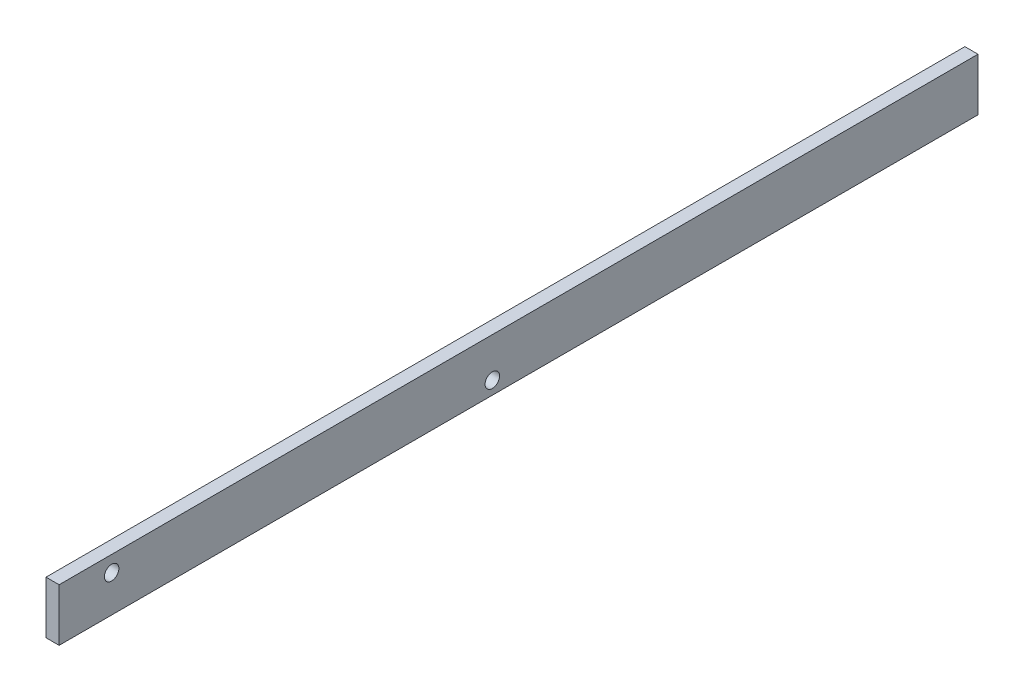
ISO-10303-21;
HEADER;
FILE_DESCRIPTION(('STEP AP214'),'2;1');
FILE_NAME('part.step','',(''),(''),'','','');
FILE_SCHEMA(('AUTOMOTIVE_DESIGN { 1 0 10303 214 1 1 1 1 }'));
ENDSEC;
DATA;
#1=APPLICATION_CONTEXT('core data for automotive mechanical design processes');
#2=APPLICATION_PROTOCOL_DEFINITION('international standard','automotive_design',2000,#1);
#3=PRODUCT_CONTEXT('',#1,'mechanical');
#4=PRODUCT('Part','Part','',(#3));
#5=PRODUCT_RELATED_PRODUCT_CATEGORY('part','',(#4));
#6=PRODUCT_DEFINITION_FORMATION('','',#4);
#7=PRODUCT_DEFINITION_CONTEXT('part definition',#1,'design');
#8=PRODUCT_DEFINITION('design','',#6,#7);
#9=PRODUCT_DEFINITION_SHAPE('','',#8);
#10=(LENGTH_UNIT() NAMED_UNIT(*) SI_UNIT(.MILLI.,.METRE.));
#11=(NAMED_UNIT(*) PLANE_ANGLE_UNIT() SI_UNIT($,.RADIAN.));
#12=(NAMED_UNIT(*) SI_UNIT($,.STERADIAN.) SOLID_ANGLE_UNIT());
#13=UNCERTAINTY_MEASURE_WITH_UNIT(LENGTH_MEASURE(1.E-05),#10,'distance_accuracy_value','');
#14=(GEOMETRIC_REPRESENTATION_CONTEXT(3) GLOBAL_UNCERTAINTY_ASSIGNED_CONTEXT((#13)) GLOBAL_UNIT_ASSIGNED_CONTEXT((#10,
#11,#12)) REPRESENTATION_CONTEXT('',''));
#15=CARTESIAN_POINT('',(0.,0.,0.));
#16=DIRECTION('',(0.,0.,1.));
#17=DIRECTION('',(1.,0.,0.));
#18=AXIS2_PLACEMENT_3D('',#15,#16,#17);
#19=CARTESIAN_POINT('',(0.,0.,222.25));
#20=DIRECTION('',(1.,0.,0.));
#21=DIRECTION('',(0.,1.,0.));
#22=AXIS2_PLACEMENT_3D('',#19,#20,#21);
#23=PLANE('',#22);
#24=CARTESIAN_POINT('',(0.,-9.525,117.475));
#25=DIRECTION('',(1.,0.,0.));
#26=DIRECTION('',(0.,0.,-1.));
#27=AXIS2_PLACEMENT_3D('',#24,#25,#26);
#28=CIRCLE('',#27,1.75259999999999);
#29=CARTESIAN_POINT('',(0.,-9.525,115.7224));
#30=VERTEX_POINT('',#29);
#31=EDGE_CURVE('E139',#30,#30,#28,.T.);
#32=ORIENTED_EDGE('',*,*,#31,.T.);
#33=EDGE_LOOP('',(#32));
#34=FACE_BOUND('',#33,.T.);
#35=CARTESIAN_POINT('',(0.,-3.81,209.55));
#36=DIRECTION('',(1.,0.,0.));
#37=DIRECTION('',(0.,0.,-1.));
#38=AXIS2_PLACEMENT_3D('',#35,#36,#37);
#39=CIRCLE('',#38,1.7526);
#40=CARTESIAN_POINT('',(0.,-3.81,207.7974));
#41=VERTEX_POINT('',#40);
#42=EDGE_CURVE('E115',#41,#41,#39,.T.);
#43=ORIENTED_EDGE('',*,*,#42,.T.);
#44=EDGE_LOOP('',(#43));
#45=FACE_BOUND('',#44,.T.);
#46=DIRECTION('',(0.,-1.,0.));
#47=VECTOR('',#46,1.);
#48=CARTESIAN_POINT('',(0.,0.,0.));
#49=LINE('',#48,#47);
#50=CARTESIAN_POINT('',(0.,0.,0.));
#51=VERTEX_POINT('',#50);
#52=CARTESIAN_POINT('',(0.,-12.7,0.));
#53=VERTEX_POINT('',#52);
#54=EDGE_CURVE('E111',#51,#53,#49,.T.);
#55=ORIENTED_EDGE('',*,*,#54,.T.);
#56=DIRECTION('',(0.,0.,-1.));
#57=VECTOR('',#56,1.);
#58=CARTESIAN_POINT('',(0.,-12.7,222.25));
#59=LINE('',#58,#57);
#60=CARTESIAN_POINT('',(0.,-12.7,222.25));
#61=VERTEX_POINT('',#60);
#62=EDGE_CURVE('E11',#61,#53,#59,.T.);
#63=ORIENTED_EDGE('',*,*,#62,.F.);
#64=DIRECTION('',(0.,-1.,0.));
#65=VECTOR('',#64,1.);
#66=CARTESIAN_POINT('',(0.,0.,222.25));
#67=LINE('',#66,#65);
#68=CARTESIAN_POINT('',(0.,0.,222.25));
#69=VERTEX_POINT('',#68);
#70=EDGE_CURVE('E95',#69,#61,#67,.T.);
#71=ORIENTED_EDGE('',*,*,#70,.F.);
#72=DIRECTION('',(0.,0.,-1.));
#73=VECTOR('',#72,1.);
#74=CARTESIAN_POINT('',(0.,0.,222.25));
#75=LINE('',#74,#73);
#76=EDGE_CURVE('E107',#69,#51,#75,.T.);
#77=ORIENTED_EDGE('',*,*,#76,.T.);
#78=EDGE_LOOP('',(#55,#63,#71,#77));
#79=FACE_BOUND('',#78,.T.);
#80=ADVANCED_FACE('F43',(#34,#45,#79),#23,.F.);
#81=CARTESIAN_POINT('',(0.,-12.7,222.25));
#82=DIRECTION('',(0.,1.,0.));
#83=DIRECTION('',(0.,0.,1.));
#84=AXIS2_PLACEMENT_3D('',#81,#82,#83);
#85=PLANE('',#84);
#86=DIRECTION('',(1.,0.,0.));
#87=VECTOR('',#86,1.);
#88=CARTESIAN_POINT('',(0.,-12.7,0.));
#89=LINE('',#88,#87);
#90=CARTESIAN_POINT('',(3.175,-12.7,0.));
#91=VERTEX_POINT('',#90);
#92=EDGE_CURVE('E100',#53,#91,#89,.T.);
#93=ORIENTED_EDGE('',*,*,#92,.T.);
#94=DIRECTION('',(0.,0.,-1.));
#95=VECTOR('',#94,1.);
#96=CARTESIAN_POINT('',(3.175,-12.7,222.25));
#97=LINE('',#96,#95);
#98=CARTESIAN_POINT('',(3.175,-12.7,222.25));
#99=VERTEX_POINT('',#98);
#100=EDGE_CURVE('E52',#99,#91,#97,.T.);
#101=ORIENTED_EDGE('',*,*,#100,.F.);
#102=DIRECTION('',(1.,0.,0.));
#103=VECTOR('',#102,1.);
#104=CARTESIAN_POINT('',(0.,-12.7,222.25));
#105=LINE('',#104,#103);
#106=EDGE_CURVE('E90',#61,#99,#105,.T.);
#107=ORIENTED_EDGE('',*,*,#106,.F.);
#108=ORIENTED_EDGE('',*,*,#62,.T.);
#109=EDGE_LOOP('',(#93,#101,#107,#108));
#110=FACE_BOUND('',#109,.T.);
#111=ADVANCED_FACE('F99',(#110),#85,.F.);
#112=CARTESIAN_POINT('',(3.175,0.,222.25));
#113=DIRECTION('',(-1.,0.,0.));
#114=DIRECTION('',(0.,-1.,0.));
#115=AXIS2_PLACEMENT_3D('',#112,#113,#114);
#116=PLANE('',#115);
#117=CARTESIAN_POINT('',(3.175,-9.525,117.475));
#118=DIRECTION('',(1.,0.,0.));
#119=DIRECTION('',(0.,0.,-1.));
#120=AXIS2_PLACEMENT_3D('',#117,#118,#119);
#121=CIRCLE('',#120,1.75259999999999);
#122=CARTESIAN_POINT('',(3.175,-9.525,115.7224));
#123=VERTEX_POINT('',#122);
#124=EDGE_CURVE('E143',#123,#123,#121,.T.);
#125=ORIENTED_EDGE('',*,*,#124,.F.);
#126=EDGE_LOOP('',(#125));
#127=FACE_BOUND('',#126,.T.);
#128=CARTESIAN_POINT('',(3.175,-3.81,209.55));
#129=DIRECTION('',(1.,0.,0.));
#130=DIRECTION('',(0.,0.,-1.));
#131=AXIS2_PLACEMENT_3D('',#128,#129,#130);
#132=CIRCLE('',#131,1.75259999999999);
#133=CARTESIAN_POINT('',(3.175,-3.81,207.7974));
#134=VERTEX_POINT('',#133);
#135=EDGE_CURVE('E135',#134,#134,#132,.T.);
#136=ORIENTED_EDGE('',*,*,#135,.F.);
#137=EDGE_LOOP('',(#136));
#138=FACE_BOUND('',#137,.T.);
#139=DIRECTION('',(0.,1.,0.));
#140=VECTOR('',#139,1.);
#141=CARTESIAN_POINT('',(3.175,0.,0.));
#142=LINE('',#141,#140);
#143=CARTESIAN_POINT('',(3.175,0.,0.));
#144=VERTEX_POINT('',#143);
#145=EDGE_CURVE('E77',#91,#144,#142,.T.);
#146=ORIENTED_EDGE('',*,*,#145,.T.);
#147=DIRECTION('',(0.,0.,-1.));
#148=VECTOR('',#147,1.);
#149=CARTESIAN_POINT('',(3.175,0.,222.25));
#150=LINE('',#149,#148);
#151=CARTESIAN_POINT('',(3.175,0.,222.25));
#152=VERTEX_POINT('',#151);
#153=EDGE_CURVE('E102',#152,#144,#150,.T.);
#154=ORIENTED_EDGE('',*,*,#153,.F.);
#155=DIRECTION('',(0.,1.,0.));
#156=VECTOR('',#155,1.);
#157=CARTESIAN_POINT('',(3.175,0.,222.25));
#158=LINE('',#157,#156);
#159=EDGE_CURVE('E93',#99,#152,#158,.T.);
#160=ORIENTED_EDGE('',*,*,#159,.F.);
#161=ORIENTED_EDGE('',*,*,#100,.T.);
#162=EDGE_LOOP('',(#146,#154,#160,#161));
#163=FACE_BOUND('',#162,.T.);
#164=ADVANCED_FACE('F103',(#127,#138,#163),#116,.F.);
#165=CARTESIAN_POINT('',(0.,0.,222.25));
#166=DIRECTION('',(0.,-1.,0.));
#167=DIRECTION('',(0.,0.,-1.));
#168=AXIS2_PLACEMENT_3D('',#165,#166,#167);
#169=PLANE('',#168);
#170=DIRECTION('',(-1.,0.,0.));
#171=VECTOR('',#170,1.);
#172=CARTESIAN_POINT('',(0.,0.,0.));
#173=LINE('',#172,#171);
#174=EDGE_CURVE('E83',#144,#51,#173,.T.);
#175=ORIENTED_EDGE('',*,*,#174,.T.);
#176=ORIENTED_EDGE('',*,*,#76,.F.);
#177=DIRECTION('',(-1.,0.,0.));
#178=VECTOR('',#177,1.);
#179=CARTESIAN_POINT('',(0.,0.,222.25));
#180=LINE('',#179,#178);
#181=EDGE_CURVE('E60',#152,#69,#180,.T.);
#182=ORIENTED_EDGE('',*,*,#181,.F.);
#183=ORIENTED_EDGE('',*,*,#153,.T.);
#184=EDGE_LOOP('',(#175,#176,#182,#183));
#185=FACE_BOUND('',#184,.T.);
#186=ADVANCED_FACE('F125',(#185),#169,.F.);
#187=CARTESIAN_POINT('',(0.,0.,222.25));
#188=DIRECTION('',(0.,0.,1.));
#189=DIRECTION('',(1.,0.,0.));
#190=AXIS2_PLACEMENT_3D('',#187,#188,#189);
#191=PLANE('',#190);
#192=ORIENTED_EDGE('',*,*,#70,.T.);
#193=ORIENTED_EDGE('',*,*,#106,.T.);
#194=ORIENTED_EDGE('',*,*,#159,.T.);
#195=ORIENTED_EDGE('',*,*,#181,.T.);
#196=EDGE_LOOP('',(#192,#193,#194,#195));
#197=FACE_BOUND('',#196,.T.);
#198=ADVANCED_FACE('F91',(#197),#191,.T.);
#199=CARTESIAN_POINT('',(0.,0.,0.));
#200=DIRECTION('',(0.,0.,1.));
#201=DIRECTION('',(1.,0.,0.));
#202=AXIS2_PLACEMENT_3D('',#199,#200,#201);
#203=PLANE('',#202);
#204=ORIENTED_EDGE('',*,*,#54,.F.);
#205=ORIENTED_EDGE('',*,*,#174,.F.);
#206=ORIENTED_EDGE('',*,*,#145,.F.);
#207=ORIENTED_EDGE('',*,*,#92,.F.);
#208=EDGE_LOOP('',(#204,#205,#206,#207));
#209=FACE_BOUND('',#208,.T.);
#210=ADVANCED_FACE('F128',(#209),#203,.F.);
#211=CARTESIAN_POINT('',(3.175,-3.81,209.55));
#212=DIRECTION('',(1.,0.,0.));
#213=DIRECTION('',(0.,0.,-1.));
#214=AXIS2_PLACEMENT_3D('',#211,#212,#213);
#215=CYLINDRICAL_SURFACE('',#214,1.75259999999999);
#216=ORIENTED_EDGE('',*,*,#42,.F.);
#217=EDGE_LOOP('',(#216));
#218=FACE_BOUND('',#217,.T.);
#219=ORIENTED_EDGE('',*,*,#135,.T.);
#220=EDGE_LOOP('',(#219));
#221=FACE_BOUND('',#220,.T.);
#222=ADVANCED_FACE('F155',(#218,#221),#215,.F.);
#223=CARTESIAN_POINT('',(3.175,-9.525,117.475));
#224=DIRECTION('',(1.,0.,0.));
#225=DIRECTION('',(0.,0.,-1.));
#226=AXIS2_PLACEMENT_3D('',#223,#224,#225);
#227=CYLINDRICAL_SURFACE('',#226,1.75259999999999);
#228=ORIENTED_EDGE('',*,*,#31,.F.);
#229=EDGE_LOOP('',(#228));
#230=FACE_BOUND('',#229,.T.);
#231=ORIENTED_EDGE('',*,*,#124,.T.);
#232=EDGE_LOOP('',(#231));
#233=FACE_BOUND('',#232,.T.);
#234=ADVANCED_FACE('F148',(#230,#233),#227,.F.);
#235=CLOSED_SHELL('',(#80,#111,#164,#186,#198,#210,#222,#234));
#236=MANIFOLD_SOLID_BREP('B2',#235);
#237=ADVANCED_BREP_SHAPE_REPRESENTATION('',(#18,#236),#14);
#238=SHAPE_DEFINITION_REPRESENTATION(#9,#237);
ENDSEC;
END-ISO-10303-21;
